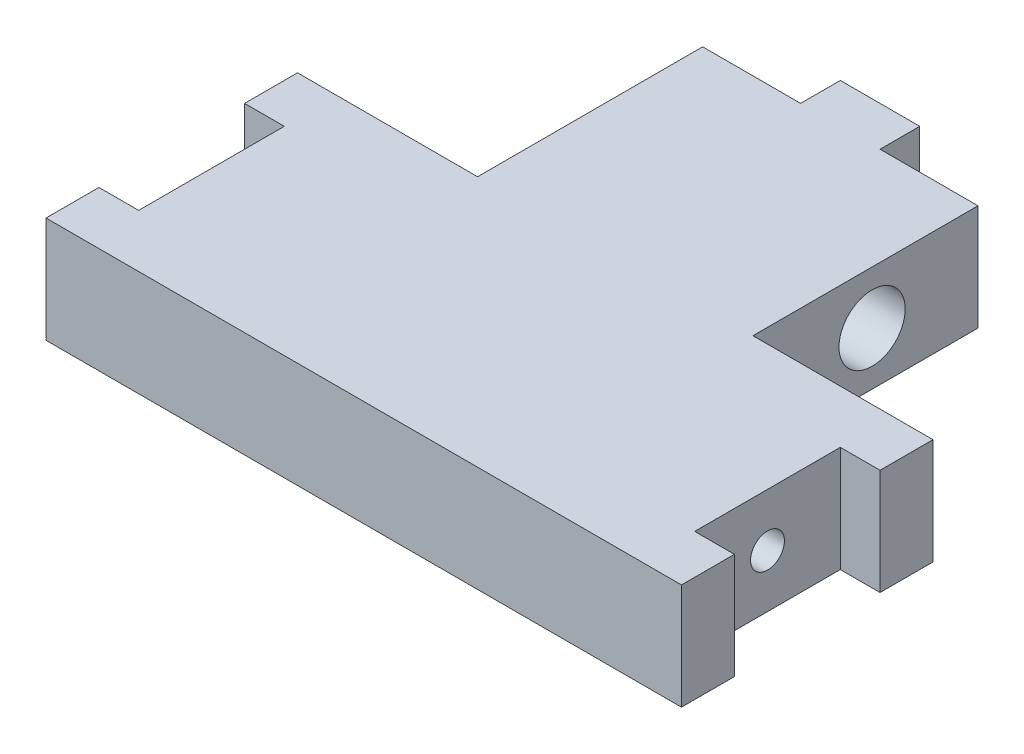
ISO-10303-21;
HEADER;
FILE_DESCRIPTION(('STEP AP214'),'2;1');
FILE_NAME('part.step','',(''),(''),'','','');
FILE_SCHEMA(('AUTOMOTIVE_DESIGN { 1 0 10303 214 1 1 1 1 }'));
ENDSEC;
DATA;
#1=APPLICATION_CONTEXT('core data for automotive mechanical design processes');
#2=APPLICATION_PROTOCOL_DEFINITION('international standard','automotive_design',2000,#1);
#3=PRODUCT_CONTEXT('',#1,'mechanical');
#4=PRODUCT('Part','Part','',(#3));
#5=PRODUCT_RELATED_PRODUCT_CATEGORY('part','',(#4));
#6=PRODUCT_DEFINITION_FORMATION('','',#4);
#7=PRODUCT_DEFINITION_CONTEXT('part definition',#1,'design');
#8=PRODUCT_DEFINITION('design','',#6,#7);
#9=PRODUCT_DEFINITION_SHAPE('','',#8);
#10=(LENGTH_UNIT() NAMED_UNIT(*) SI_UNIT(.MILLI.,.METRE.));
#11=(NAMED_UNIT(*) PLANE_ANGLE_UNIT() SI_UNIT($,.RADIAN.));
#12=(NAMED_UNIT(*) SI_UNIT($,.STERADIAN.) SOLID_ANGLE_UNIT());
#13=UNCERTAINTY_MEASURE_WITH_UNIT(LENGTH_MEASURE(1.E-05),#10,'distance_accuracy_value','');
#14=(GEOMETRIC_REPRESENTATION_CONTEXT(3) GLOBAL_UNCERTAINTY_ASSIGNED_CONTEXT((#13)) GLOBAL_UNIT_ASSIGNED_CONTEXT((#10,
#11,#12)) REPRESENTATION_CONTEXT('',''));
#15=CARTESIAN_POINT('',(0.,0.,0.));
#16=DIRECTION('',(0.,0.,1.));
#17=DIRECTION('',(1.,0.,0.));
#18=AXIS2_PLACEMENT_3D('',#15,#16,#17);
#19=CARTESIAN_POINT('',(-16.51,12.7,0.));
#20=DIRECTION('',(0.,0.,1.));
#21=DIRECTION('',(1.,0.,0.));
#22=AXIS2_PLACEMENT_3D('',#19,#20,#21);
#23=PLANE('',#22);
#24=CARTESIAN_POINT('',(-10.16,6.35,0.));
#25=DIRECTION('',(0.,0.,-1.));
#26=DIRECTION('',(-1.,0.,0.));
#27=AXIS2_PLACEMENT_3D('',#24,#25,#26);
#28=CIRCLE('',#27,1.1303);
#29=CARTESIAN_POINT('',(-11.2903,6.35,0.));
#30=VERTEX_POINT('',#29);
#31=EDGE_CURVE('E368',#30,#30,#28,.T.);
#32=ORIENTED_EDGE('',*,*,#31,.F.);
#33=EDGE_LOOP('',(#32));
#34=FACE_BOUND('',#33,.T.);
#35=DIRECTION('',(-1.,0.,0.));
#36=VECTOR('',#35,1.);
#37=CARTESIAN_POINT('',(-16.51,0.,0.));
#38=LINE('',#37,#36);
#39=CARTESIAN_POINT('',(-4.7625,0.,0.));
#40=VERTEX_POINT('',#39);
#41=CARTESIAN_POINT('',(-16.51,0.,0.));
#42=VERTEX_POINT('',#41);
#43=EDGE_CURVE('E202',#40,#42,#38,.T.);
#44=ORIENTED_EDGE('',*,*,#43,.T.);
#45=DIRECTION('',(0.,-1.,0.));
#46=VECTOR('',#45,1.);
#47=CARTESIAN_POINT('',(-16.51,12.7,0.));
#48=LINE('',#47,#46);
#49=CARTESIAN_POINT('',(-16.51,12.7,0.));
#50=VERTEX_POINT('',#49);
#51=EDGE_CURVE('E11',#50,#42,#48,.T.);
#52=ORIENTED_EDGE('',*,*,#51,.F.);
#53=DIRECTION('',(-1.,0.,0.));
#54=VECTOR('',#53,1.);
#55=CARTESIAN_POINT('',(-16.51,12.7,0.));
#56=LINE('',#55,#54);
#57=CARTESIAN_POINT('',(-4.7625,12.7,0.));
#58=VERTEX_POINT('',#57);
#59=EDGE_CURVE('E241',#58,#50,#56,.T.);
#60=ORIENTED_EDGE('',*,*,#59,.F.);
#61=DIRECTION('',(0.,-1.,0.));
#62=VECTOR('',#61,1.);
#63=CARTESIAN_POINT('',(-4.7625,12.7,0.));
#64=LINE('',#63,#62);
#65=EDGE_CURVE('E198',#58,#40,#64,.T.);
#66=ORIENTED_EDGE('',*,*,#65,.T.);
#67=EDGE_LOOP('',(#44,#52,#60,#66));
#68=FACE_BOUND('',#67,.T.);
#69=ADVANCED_FACE('F33',(#34,#68),#23,.F.);
#70=CARTESIAN_POINT('',(-16.51,12.7,0.));
#71=DIRECTION('',(1.,0.,0.));
#72=DIRECTION('',(0.,0.,-1.));
#73=AXIS2_PLACEMENT_3D('',#70,#71,#72);
#74=PLANE('',#73);
#75=CARTESIAN_POINT('',(-16.51,6.35,12.7));
#76=DIRECTION('',(1.,0.,0.));
#77=DIRECTION('',(0.,0.,-1.));
#78=AXIS2_PLACEMENT_3D('',#75,#76,#77);
#79=CIRCLE('',#78,3.96875);
#80=CARTESIAN_POINT('',(-16.51,6.35,8.73124999999999));
#81=VERTEX_POINT('',#80);
#82=EDGE_CURVE('E381',#81,#81,#79,.T.);
#83=ORIENTED_EDGE('',*,*,#82,.T.);
#84=EDGE_LOOP('',(#83));
#85=FACE_BOUND('',#84,.T.);
#86=DIRECTION('',(0.,0.,1.));
#87=VECTOR('',#86,1.);
#88=CARTESIAN_POINT('',(-16.51,0.,0.));
#89=LINE('',#88,#87);
#90=CARTESIAN_POINT('',(-16.51,0.,26.9875));
#91=VERTEX_POINT('',#90);
#92=EDGE_CURVE('E205',#42,#91,#89,.T.);
#93=ORIENTED_EDGE('',*,*,#92,.T.);
#94=DIRECTION('',(0.,-1.,0.));
#95=VECTOR('',#94,1.);
#96=CARTESIAN_POINT('',(-16.51,12.7,26.9875));
#97=LINE('',#96,#95);
#98=CARTESIAN_POINT('',(-16.51,12.7,26.9875));
#99=VERTEX_POINT('',#98);
#100=EDGE_CURVE('E42',#99,#91,#97,.T.);
#101=ORIENTED_EDGE('',*,*,#100,.F.);
#102=DIRECTION('',(0.,0.,1.));
#103=VECTOR('',#102,1.);
#104=CARTESIAN_POINT('',(-16.51,12.7,0.));
#105=LINE('',#104,#103);
#106=EDGE_CURVE('E129',#50,#99,#105,.T.);
#107=ORIENTED_EDGE('',*,*,#106,.F.);
#108=ORIENTED_EDGE('',*,*,#51,.T.);
#109=EDGE_LOOP('',(#93,#101,#107,#108));
#110=FACE_BOUND('',#109,.T.);
#111=ADVANCED_FACE('F360',(#85,#110),#74,.F.);
#112=CARTESIAN_POINT('',(-16.51,12.7,26.9875));
#113=DIRECTION('',(0.,0.,1.));
#114=DIRECTION('',(1.,0.,0.));
#115=AXIS2_PLACEMENT_3D('',#112,#113,#114);
#116=PLANE('',#115);
#117=DIRECTION('',(-1.,0.,0.));
#118=VECTOR('',#117,1.);
#119=CARTESIAN_POINT('',(-16.51,0.,26.9875));
#120=LINE('',#119,#118);
#121=CARTESIAN_POINT('',(-38.1,0.,26.9875));
#122=VERTEX_POINT('',#121);
#123=EDGE_CURVE('E208',#91,#122,#120,.T.);
#124=ORIENTED_EDGE('',*,*,#123,.T.);
#125=DIRECTION('',(0.,-1.,0.));
#126=VECTOR('',#125,1.);
#127=CARTESIAN_POINT('',(-38.1,12.7,26.9875));
#128=LINE('',#127,#126);
#129=CARTESIAN_POINT('',(-38.1,12.7,26.9875));
#130=VERTEX_POINT('',#129);
#131=EDGE_CURVE('E284',#130,#122,#128,.T.);
#132=ORIENTED_EDGE('',*,*,#131,.F.);
#133=DIRECTION('',(-1.,0.,0.));
#134=VECTOR('',#133,1.);
#135=CARTESIAN_POINT('',(-16.51,12.7,26.9875));
#136=LINE('',#135,#134);
#137=EDGE_CURVE('E293',#99,#130,#136,.T.);
#138=ORIENTED_EDGE('',*,*,#137,.F.);
#139=ORIENTED_EDGE('',*,*,#100,.T.);
#140=EDGE_LOOP('',(#124,#132,#138,#139));
#141=FACE_BOUND('',#140,.T.);
#142=ADVANCED_FACE('F291',(#141),#116,.F.);
#143=CARTESIAN_POINT('',(-38.1,12.7,26.9875));
#144=DIRECTION('',(1.,0.,0.));
#145=DIRECTION('',(0.,0.,-1.));
#146=AXIS2_PLACEMENT_3D('',#143,#144,#145);
#147=PLANE('',#146);
#148=DIRECTION('',(0.,0.,1.));
#149=VECTOR('',#148,1.);
#150=CARTESIAN_POINT('',(-38.1,0.,26.9875));
#151=LINE('',#150,#149);
#152=CARTESIAN_POINT('',(-38.1,0.,33.3375));
#153=VERTEX_POINT('',#152);
#154=EDGE_CURVE('E210',#122,#153,#151,.T.);
#155=ORIENTED_EDGE('',*,*,#154,.T.);
#156=DIRECTION('',(0.,-1.,0.));
#157=VECTOR('',#156,1.);
#158=CARTESIAN_POINT('',(-38.1,12.7,33.3375));
#159=LINE('',#158,#157);
#160=CARTESIAN_POINT('',(-38.1,12.7,33.3375));
#161=VERTEX_POINT('',#160);
#162=EDGE_CURVE('E281',#161,#153,#159,.T.);
#163=ORIENTED_EDGE('',*,*,#162,.F.);
#164=DIRECTION('',(0.,0.,1.));
#165=VECTOR('',#164,1.);
#166=CARTESIAN_POINT('',(-38.1,12.7,26.9875));
#167=LINE('',#166,#165);
#168=EDGE_CURVE('E311',#130,#161,#167,.T.);
#169=ORIENTED_EDGE('',*,*,#168,.F.);
#170=ORIENTED_EDGE('',*,*,#131,.T.);
#171=EDGE_LOOP('',(#155,#163,#169,#170));
#172=FACE_BOUND('',#171,.T.);
#173=ADVANCED_FACE('F302',(#172),#147,.F.);
#174=CARTESIAN_POINT('',(-38.1,12.7,33.3375));
#175=DIRECTION('',(0.,0.,-1.));
#176=DIRECTION('',(-1.,0.,0.));
#177=AXIS2_PLACEMENT_3D('',#174,#175,#176);
#178=PLANE('',#177);
#179=DIRECTION('',(1.,0.,0.));
#180=VECTOR('',#179,1.);
#181=CARTESIAN_POINT('',(-38.1,0.,33.3375));
#182=LINE('',#181,#180);
#183=CARTESIAN_POINT('',(-33.3375,0.,33.3375));
#184=VERTEX_POINT('',#183);
#185=EDGE_CURVE('E212',#153,#184,#182,.T.);
#186=ORIENTED_EDGE('',*,*,#185,.T.);
#187=DIRECTION('',(0.,-1.,0.));
#188=VECTOR('',#187,1.);
#189=CARTESIAN_POINT('',(-33.3375,12.7,33.3375));
#190=LINE('',#189,#188);
#191=CARTESIAN_POINT('',(-33.3375,12.7,33.3375));
#192=VERTEX_POINT('',#191);
#193=EDGE_CURVE('E278',#192,#184,#190,.T.);
#194=ORIENTED_EDGE('',*,*,#193,.F.);
#195=DIRECTION('',(1.,0.,0.));
#196=VECTOR('',#195,1.);
#197=CARTESIAN_POINT('',(-38.1,12.7,33.3375));
#198=LINE('',#197,#196);
#199=EDGE_CURVE('E308',#161,#192,#198,.T.);
#200=ORIENTED_EDGE('',*,*,#199,.F.);
#201=ORIENTED_EDGE('',*,*,#162,.T.);
#202=EDGE_LOOP('',(#186,#194,#200,#201));
#203=FACE_BOUND('',#202,.T.);
#204=ADVANCED_FACE('F306',(#203),#178,.F.);
#205=CARTESIAN_POINT('',(-33.3375,12.7,33.3375));
#206=DIRECTION('',(1.,0.,0.));
#207=DIRECTION('',(0.,0.,-1.));
#208=AXIS2_PLACEMENT_3D('',#205,#206,#207);
#209=PLANE('',#208);
#210=CARTESIAN_POINT('',(-33.3375,6.35,42.06875));
#211=DIRECTION('',(1.,0.,0.));
#212=DIRECTION('',(0.,0.,-1.));
#213=AXIS2_PLACEMENT_3D('',#210,#211,#212);
#214=CIRCLE('',#213,2.032);
#215=CARTESIAN_POINT('',(-33.3375,6.35,40.03675));
#216=VERTEX_POINT('',#215);
#217=EDGE_CURVE('E206',#216,#216,#214,.T.);
#218=ORIENTED_EDGE('',*,*,#217,.T.);
#219=EDGE_LOOP('',(#218));
#220=FACE_BOUND('',#219,.T.);
#221=DIRECTION('',(0.,0.,1.));
#222=VECTOR('',#221,1.);
#223=CARTESIAN_POINT('',(-33.3375,0.,33.3375));
#224=LINE('',#223,#222);
#225=CARTESIAN_POINT('',(-33.3375,0.,50.8));
#226=VERTEX_POINT('',#225);
#227=EDGE_CURVE('E214',#184,#226,#224,.T.);
#228=ORIENTED_EDGE('',*,*,#227,.T.);
#229=DIRECTION('',(0.,-1.,0.));
#230=VECTOR('',#229,1.);
#231=CARTESIAN_POINT('',(-33.3375,12.7,50.8));
#232=LINE('',#231,#230);
#233=CARTESIAN_POINT('',(-33.3375,12.7,50.8));
#234=VERTEX_POINT('',#233);
#235=EDGE_CURVE('E275',#234,#226,#232,.T.);
#236=ORIENTED_EDGE('',*,*,#235,.F.);
#237=DIRECTION('',(0.,0.,1.));
#238=VECTOR('',#237,1.);
#239=CARTESIAN_POINT('',(-33.3375,12.7,33.3375));
#240=LINE('',#239,#238);
#241=EDGE_CURVE('E310',#192,#234,#240,.T.);
#242=ORIENTED_EDGE('',*,*,#241,.F.);
#243=ORIENTED_EDGE('',*,*,#193,.T.);
#244=EDGE_LOOP('',(#228,#236,#242,#243));
#245=FACE_BOUND('',#244,.T.);
#246=ADVANCED_FACE('F392',(#220,#245),#209,.F.);
#247=CARTESIAN_POINT('',(-33.3375,12.7,50.8));
#248=DIRECTION('',(0.,0.,1.));
#249=DIRECTION('',(1.,0.,0.));
#250=AXIS2_PLACEMENT_3D('',#247,#248,#249);
#251=PLANE('',#250);
#252=DIRECTION('',(-1.,0.,0.));
#253=VECTOR('',#252,1.);
#254=CARTESIAN_POINT('',(-33.3375,0.,50.8));
#255=LINE('',#254,#253);
#256=CARTESIAN_POINT('',(-38.1,0.,50.8));
#257=VERTEX_POINT('',#256);
#258=EDGE_CURVE('E216',#226,#257,#255,.T.);
#259=ORIENTED_EDGE('',*,*,#258,.T.);
#260=DIRECTION('',(0.,-1.,0.));
#261=VECTOR('',#260,1.);
#262=CARTESIAN_POINT('',(-38.1,12.7,50.8));
#263=LINE('',#262,#261);
#264=CARTESIAN_POINT('',(-38.1,12.7,50.8));
#265=VERTEX_POINT('',#264);
#266=EDGE_CURVE('E272',#265,#257,#263,.T.);
#267=ORIENTED_EDGE('',*,*,#266,.F.);
#268=DIRECTION('',(-1.,0.,0.));
#269=VECTOR('',#268,1.);
#270=CARTESIAN_POINT('',(-33.3375,12.7,50.8));
#271=LINE('',#270,#269);
#272=EDGE_CURVE('E313',#234,#265,#271,.T.);
#273=ORIENTED_EDGE('',*,*,#272,.F.);
#274=ORIENTED_EDGE('',*,*,#235,.T.);
#275=EDGE_LOOP('',(#259,#267,#273,#274));
#276=FACE_BOUND('',#275,.T.);
#277=ADVANCED_FACE('F507',(#276),#251,.F.);
#278=CARTESIAN_POINT('',(-38.1,12.7,50.8));
#279=DIRECTION('',(1.,0.,0.));
#280=DIRECTION('',(0.,0.,-1.));
#281=AXIS2_PLACEMENT_3D('',#278,#279,#280);
#282=PLANE('',#281);
#283=DIRECTION('',(0.,0.,1.));
#284=VECTOR('',#283,1.);
#285=CARTESIAN_POINT('',(-38.1,0.,50.8));
#286=LINE('',#285,#284);
#287=CARTESIAN_POINT('',(-38.1,0.,57.15));
#288=VERTEX_POINT('',#287);
#289=EDGE_CURVE('E218',#257,#288,#286,.T.);
#290=ORIENTED_EDGE('',*,*,#289,.T.);
#291=DIRECTION('',(0.,-1.,0.));
#292=VECTOR('',#291,1.);
#293=CARTESIAN_POINT('',(-38.1,12.7,57.15));
#294=LINE('',#293,#292);
#295=CARTESIAN_POINT('',(-38.1,12.7,57.15));
#296=VERTEX_POINT('',#295);
#297=EDGE_CURVE('E269',#296,#288,#294,.T.);
#298=ORIENTED_EDGE('',*,*,#297,.F.);
#299=DIRECTION('',(0.,0.,1.));
#300=VECTOR('',#299,1.);
#301=CARTESIAN_POINT('',(-38.1,12.7,50.8));
#302=LINE('',#301,#300);
#303=EDGE_CURVE('E319',#265,#296,#302,.T.);
#304=ORIENTED_EDGE('',*,*,#303,.F.);
#305=ORIENTED_EDGE('',*,*,#266,.T.);
#306=EDGE_LOOP('',(#290,#298,#304,#305));
#307=FACE_BOUND('',#306,.T.);
#308=ADVANCED_FACE('F582',(#307),#282,.F.);
#309=CARTESIAN_POINT('',(-38.1,12.7,57.15));
#310=DIRECTION('',(0.,0.,-1.));
#311=DIRECTION('',(-1.,0.,0.));
#312=AXIS2_PLACEMENT_3D('',#309,#310,#311);
#313=PLANE('',#312);
#314=DIRECTION('',(1.,0.,0.));
#315=VECTOR('',#314,1.);
#316=CARTESIAN_POINT('',(-38.1,0.,57.15));
#317=LINE('',#316,#315);
#318=CARTESIAN_POINT('',(38.1,0.,57.15));
#319=VERTEX_POINT('',#318);
#320=EDGE_CURVE('E220',#288,#319,#317,.T.);
#321=ORIENTED_EDGE('',*,*,#320,.T.);
#322=DIRECTION('',(0.,-1.,0.));
#323=VECTOR('',#322,1.);
#324=CARTESIAN_POINT('',(38.1,12.7,57.15));
#325=LINE('',#324,#323);
#326=CARTESIAN_POINT('',(38.1,12.7,57.15));
#327=VERTEX_POINT('',#326);
#328=EDGE_CURVE('E266',#327,#319,#325,.T.);
#329=ORIENTED_EDGE('',*,*,#328,.F.);
#330=DIRECTION('',(1.,0.,0.));
#331=VECTOR('',#330,1.);
#332=CARTESIAN_POINT('',(-38.1,12.7,57.15));
#333=LINE('',#332,#331);
#334=EDGE_CURVE('E321',#296,#327,#333,.T.);
#335=ORIENTED_EDGE('',*,*,#334,.F.);
#336=ORIENTED_EDGE('',*,*,#297,.T.);
#337=EDGE_LOOP('',(#321,#329,#335,#336));
#338=FACE_BOUND('',#337,.T.);
#339=ADVANCED_FACE('F572',(#338),#313,.F.);
#340=CARTESIAN_POINT('',(38.1,12.7,50.8));
#341=DIRECTION('',(-1.,0.,0.));
#342=DIRECTION('',(0.,0.,1.));
#343=AXIS2_PLACEMENT_3D('',#340,#341,#342);
#344=PLANE('',#343);
#345=DIRECTION('',(0.,0.,-1.));
#346=VECTOR('',#345,1.);
#347=CARTESIAN_POINT('',(38.1,0.,50.8));
#348=LINE('',#347,#346);
#349=CARTESIAN_POINT('',(38.1,0.,50.8));
#350=VERTEX_POINT('',#349);
#351=EDGE_CURVE('E222',#319,#350,#348,.T.);
#352=ORIENTED_EDGE('',*,*,#351,.T.);
#353=DIRECTION('',(0.,-1.,0.));
#354=VECTOR('',#353,1.);
#355=CARTESIAN_POINT('',(38.1,12.7,50.8));
#356=LINE('',#355,#354);
#357=CARTESIAN_POINT('',(38.1,12.7,50.8));
#358=VERTEX_POINT('',#357);
#359=EDGE_CURVE('E263',#358,#350,#356,.T.);
#360=ORIENTED_EDGE('',*,*,#359,.F.);
#361=DIRECTION('',(0.,0.,-1.));
#362=VECTOR('',#361,1.);
#363=CARTESIAN_POINT('',(38.1,12.7,50.8));
#364=LINE('',#363,#362);
#365=EDGE_CURVE('E323',#327,#358,#364,.T.);
#366=ORIENTED_EDGE('',*,*,#365,.F.);
#367=ORIENTED_EDGE('',*,*,#328,.T.);
#368=EDGE_LOOP('',(#352,#360,#366,#367));
#369=FACE_BOUND('',#368,.T.);
#370=ADVANCED_FACE('F562',(#369),#344,.F.);
#371=CARTESIAN_POINT('',(33.3375,12.7,50.8));
#372=DIRECTION('',(0.,0.,1.));
#373=DIRECTION('',(1.,0.,0.));
#374=AXIS2_PLACEMENT_3D('',#371,#372,#373);
#375=PLANE('',#374);
#376=DIRECTION('',(-1.,0.,0.));
#377=VECTOR('',#376,1.);
#378=CARTESIAN_POINT('',(33.3375,0.,50.8));
#379=LINE('',#378,#377);
#380=CARTESIAN_POINT('',(33.3375,0.,50.8));
#381=VERTEX_POINT('',#380);
#382=EDGE_CURVE('E224',#350,#381,#379,.T.);
#383=ORIENTED_EDGE('',*,*,#382,.T.);
#384=DIRECTION('',(0.,-1.,0.));
#385=VECTOR('',#384,1.);
#386=CARTESIAN_POINT('',(33.3375,12.7,50.8));
#387=LINE('',#386,#385);
#388=CARTESIAN_POINT('',(33.3375,12.7,50.8));
#389=VERTEX_POINT('',#388);
#390=EDGE_CURVE('E260',#389,#381,#387,.T.);
#391=ORIENTED_EDGE('',*,*,#390,.F.);
#392=DIRECTION('',(-1.,0.,0.));
#393=VECTOR('',#392,1.);
#394=CARTESIAN_POINT('',(33.3375,12.7,50.8));
#395=LINE('',#394,#393);
#396=EDGE_CURVE('E325',#358,#389,#395,.T.);
#397=ORIENTED_EDGE('',*,*,#396,.F.);
#398=ORIENTED_EDGE('',*,*,#359,.T.);
#399=EDGE_LOOP('',(#383,#391,#397,#398));
#400=FACE_BOUND('',#399,.T.);
#401=ADVANCED_FACE('F521',(#400),#375,.F.);
#402=CARTESIAN_POINT('',(33.3375,12.7,33.3375));
#403=DIRECTION('',(-1.,0.,0.));
#404=DIRECTION('',(0.,0.,1.));
#405=AXIS2_PLACEMENT_3D('',#402,#403,#404);
#406=PLANE('',#405);
#407=CARTESIAN_POINT('',(33.3375,6.35,42.06875));
#408=DIRECTION('',(1.,0.,0.));
#409=DIRECTION('',(0.,0.,-1.));
#410=AXIS2_PLACEMENT_3D('',#407,#408,#409);
#411=CIRCLE('',#410,2.032);
#412=CARTESIAN_POINT('',(33.3375,6.35,40.03675));
#413=VERTEX_POINT('',#412);
#414=EDGE_CURVE('E384',#413,#413,#411,.T.);
#415=ORIENTED_EDGE('',*,*,#414,.F.);
#416=EDGE_LOOP('',(#415));
#417=FACE_BOUND('',#416,.T.);
#418=DIRECTION('',(0.,0.,-1.));
#419=VECTOR('',#418,1.);
#420=CARTESIAN_POINT('',(33.3375,0.,33.3375));
#421=LINE('',#420,#419);
#422=CARTESIAN_POINT('',(33.3375,0.,33.3375));
#423=VERTEX_POINT('',#422);
#424=EDGE_CURVE('E226',#381,#423,#421,.T.);
#425=ORIENTED_EDGE('',*,*,#424,.T.);
#426=DIRECTION('',(0.,-1.,0.));
#427=VECTOR('',#426,1.);
#428=CARTESIAN_POINT('',(33.3375,12.7,33.3375));
#429=LINE('',#428,#427);
#430=CARTESIAN_POINT('',(33.3375,12.7,33.3375));
#431=VERTEX_POINT('',#430);
#432=EDGE_CURVE('E257',#431,#423,#429,.T.);
#433=ORIENTED_EDGE('',*,*,#432,.F.);
#434=DIRECTION('',(0.,0.,-1.));
#435=VECTOR('',#434,1.);
#436=CARTESIAN_POINT('',(33.3375,12.7,33.3375));
#437=LINE('',#436,#435);
#438=EDGE_CURVE('E327',#389,#431,#437,.T.);
#439=ORIENTED_EDGE('',*,*,#438,.F.);
#440=ORIENTED_EDGE('',*,*,#390,.T.);
#441=EDGE_LOOP('',(#425,#433,#439,#440));
#442=FACE_BOUND('',#441,.T.);
#443=ADVANCED_FACE('F516',(#417,#442),#406,.F.);
#444=CARTESIAN_POINT('',(38.1,12.7,33.3375));
#445=DIRECTION('',(0.,0.,-1.));
#446=DIRECTION('',(-1.,0.,0.));
#447=AXIS2_PLACEMENT_3D('',#444,#445,#446);
#448=PLANE('',#447);
#449=DIRECTION('',(1.,0.,0.));
#450=VECTOR('',#449,1.);
#451=CARTESIAN_POINT('',(38.1,0.,33.3375));
#452=LINE('',#451,#450);
#453=CARTESIAN_POINT('',(38.1,0.,33.3375));
#454=VERTEX_POINT('',#453);
#455=EDGE_CURVE('E228',#423,#454,#452,.T.);
#456=ORIENTED_EDGE('',*,*,#455,.T.);
#457=DIRECTION('',(0.,-1.,0.));
#458=VECTOR('',#457,1.);
#459=CARTESIAN_POINT('',(38.1,12.7,33.3375));
#460=LINE('',#459,#458);
#461=CARTESIAN_POINT('',(38.1,12.7,33.3375));
#462=VERTEX_POINT('',#461);
#463=EDGE_CURVE('E254',#462,#454,#460,.T.);
#464=ORIENTED_EDGE('',*,*,#463,.F.);
#465=DIRECTION('',(1.,0.,0.));
#466=VECTOR('',#465,1.);
#467=CARTESIAN_POINT('',(38.1,12.7,33.3375));
#468=LINE('',#467,#466);
#469=EDGE_CURVE('E329',#431,#462,#468,.T.);
#470=ORIENTED_EDGE('',*,*,#469,.F.);
#471=ORIENTED_EDGE('',*,*,#432,.T.);
#472=EDGE_LOOP('',(#456,#464,#470,#471));
#473=FACE_BOUND('',#472,.T.);
#474=ADVANCED_FACE('F520',(#473),#448,.F.);
#475=CARTESIAN_POINT('',(38.1,12.7,26.9875));
#476=DIRECTION('',(-1.,0.,0.));
#477=DIRECTION('',(0.,0.,1.));
#478=AXIS2_PLACEMENT_3D('',#475,#476,#477);
#479=PLANE('',#478);
#480=DIRECTION('',(0.,0.,-1.));
#481=VECTOR('',#480,1.);
#482=CARTESIAN_POINT('',(38.1,0.,26.9875));
#483=LINE('',#482,#481);
#484=CARTESIAN_POINT('',(38.1,0.,26.9875));
#485=VERTEX_POINT('',#484);
#486=EDGE_CURVE('E230',#454,#485,#483,.T.);
#487=ORIENTED_EDGE('',*,*,#486,.T.);
#488=DIRECTION('',(0.,-1.,0.));
#489=VECTOR('',#488,1.);
#490=CARTESIAN_POINT('',(38.1,12.7,26.9875));
#491=LINE('',#490,#489);
#492=CARTESIAN_POINT('',(38.1,12.7,26.9875));
#493=VERTEX_POINT('',#492);
#494=EDGE_CURVE('E251',#493,#485,#491,.T.);
#495=ORIENTED_EDGE('',*,*,#494,.F.);
#496=DIRECTION('',(0.,0.,-1.));
#497=VECTOR('',#496,1.);
#498=CARTESIAN_POINT('',(38.1,12.7,26.9875));
#499=LINE('',#498,#497);
#500=EDGE_CURVE('E331',#462,#493,#499,.T.);
#501=ORIENTED_EDGE('',*,*,#500,.F.);
#502=ORIENTED_EDGE('',*,*,#463,.T.);
#503=EDGE_LOOP('',(#487,#495,#501,#502));
#504=FACE_BOUND('',#503,.T.);
#505=ADVANCED_FACE('F541',(#504),#479,.F.);
#506=CARTESIAN_POINT('',(16.51,12.7,26.9875));
#507=DIRECTION('',(0.,0.,1.));
#508=DIRECTION('',(1.,0.,0.));
#509=AXIS2_PLACEMENT_3D('',#506,#507,#508);
#510=PLANE('',#509);
#511=DIRECTION('',(-1.,0.,0.));
#512=VECTOR('',#511,1.);
#513=CARTESIAN_POINT('',(16.51,0.,26.9875));
#514=LINE('',#513,#512);
#515=CARTESIAN_POINT('',(16.51,0.,26.9875));
#516=VERTEX_POINT('',#515);
#517=EDGE_CURVE('E232',#485,#516,#514,.T.);
#518=ORIENTED_EDGE('',*,*,#517,.T.);
#519=DIRECTION('',(0.,-1.,0.));
#520=VECTOR('',#519,1.);
#521=CARTESIAN_POINT('',(16.51,12.7,26.9875));
#522=LINE('',#521,#520);
#523=CARTESIAN_POINT('',(16.51,12.7,26.9875));
#524=VERTEX_POINT('',#523);
#525=EDGE_CURVE('E248',#524,#516,#522,.T.);
#526=ORIENTED_EDGE('',*,*,#525,.F.);
#527=DIRECTION('',(-1.,0.,0.));
#528=VECTOR('',#527,1.);
#529=CARTESIAN_POINT('',(16.51,12.7,26.9875));
#530=LINE('',#529,#528);
#531=EDGE_CURVE('E333',#493,#524,#530,.T.);
#532=ORIENTED_EDGE('',*,*,#531,.F.);
#533=ORIENTED_EDGE('',*,*,#494,.T.);
#534=EDGE_LOOP('',(#518,#526,#532,#533));
#535=FACE_BOUND('',#534,.T.);
#536=ADVANCED_FACE('F532',(#535),#510,.F.);
#537=CARTESIAN_POINT('',(16.51,12.7,0.));
#538=DIRECTION('',(-1.,0.,0.));
#539=DIRECTION('',(0.,0.,1.));
#540=AXIS2_PLACEMENT_3D('',#537,#538,#539);
#541=PLANE('',#540);
#542=CARTESIAN_POINT('',(16.51,6.35,12.7));
#543=DIRECTION('',(-1.,0.,0.));
#544=DIRECTION('',(0.,0.,1.));
#545=AXIS2_PLACEMENT_3D('',#542,#543,#544);
#546=CIRCLE('',#545,3.96875);
#547=CARTESIAN_POINT('',(16.51,6.35,16.66875));
#548=VERTEX_POINT('',#547);
#549=EDGE_CURVE('E36',#548,#548,#546,.T.);
#550=ORIENTED_EDGE('',*,*,#549,.T.);
#551=EDGE_LOOP('',(#550));
#552=FACE_BOUND('',#551,.T.);
#553=DIRECTION('',(0.,0.,-1.));
#554=VECTOR('',#553,1.);
#555=CARTESIAN_POINT('',(16.51,0.,0.));
#556=LINE('',#555,#554);
#557=CARTESIAN_POINT('',(16.51,0.,0.));
#558=VERTEX_POINT('',#557);
#559=EDGE_CURVE('E234',#516,#558,#556,.T.);
#560=ORIENTED_EDGE('',*,*,#559,.T.);
#561=DIRECTION('',(0.,-1.,0.));
#562=VECTOR('',#561,1.);
#563=CARTESIAN_POINT('',(16.51,12.7,0.));
#564=LINE('',#563,#562);
#565=CARTESIAN_POINT('',(16.51,12.7,0.));
#566=VERTEX_POINT('',#565);
#567=EDGE_CURVE('E245',#566,#558,#564,.T.);
#568=ORIENTED_EDGE('',*,*,#567,.F.);
#569=DIRECTION('',(0.,0.,-1.));
#570=VECTOR('',#569,1.);
#571=CARTESIAN_POINT('',(16.51,12.7,0.));
#572=LINE('',#571,#570);
#573=EDGE_CURVE('E335',#524,#566,#572,.T.);
#574=ORIENTED_EDGE('',*,*,#573,.F.);
#575=ORIENTED_EDGE('',*,*,#525,.T.);
#576=EDGE_LOOP('',(#560,#568,#574,#575));
#577=FACE_BOUND('',#576,.T.);
#578=ADVANCED_FACE('F341',(#552,#577),#541,.F.);
#579=CARTESIAN_POINT('',(16.51,12.7,0.));
#580=DIRECTION('',(0.,0.,1.));
#581=DIRECTION('',(1.,0.,0.));
#582=AXIS2_PLACEMENT_3D('',#579,#580,#581);
#583=PLANE('',#582);
#584=CARTESIAN_POINT('',(10.16,6.35,0.));
#585=DIRECTION('',(0.,0.,-1.));
#586=DIRECTION('',(-1.,0.,0.));
#587=AXIS2_PLACEMENT_3D('',#584,#585,#586);
#588=CIRCLE('',#587,1.1303);
#589=CARTESIAN_POINT('',(9.0297,6.35,0.));
#590=VERTEX_POINT('',#589);
#591=EDGE_CURVE('E373',#590,#590,#588,.T.);
#592=ORIENTED_EDGE('',*,*,#591,.F.);
#593=EDGE_LOOP('',(#592));
#594=FACE_BOUND('',#593,.T.);
#595=DIRECTION('',(-1.,0.,0.));
#596=VECTOR('',#595,1.);
#597=CARTESIAN_POINT('',(16.51,0.,0.));
#598=LINE('',#597,#596);
#599=CARTESIAN_POINT('',(4.7625,0.,0.));
#600=VERTEX_POINT('',#599);
#601=EDGE_CURVE('E236',#558,#600,#598,.T.);
#602=ORIENTED_EDGE('',*,*,#601,.T.);
#603=DIRECTION('',(0.,-1.,0.));
#604=VECTOR('',#603,1.);
#605=CARTESIAN_POINT('',(4.7625,12.7,0.));
#606=LINE('',#605,#604);
#607=CARTESIAN_POINT('',(4.7625,12.7,0.));
#608=VERTEX_POINT('',#607);
#609=EDGE_CURVE('E193',#608,#600,#606,.T.);
#610=ORIENTED_EDGE('',*,*,#609,.F.);
#611=DIRECTION('',(-1.,0.,0.));
#612=VECTOR('',#611,1.);
#613=CARTESIAN_POINT('',(16.51,12.7,0.));
#614=LINE('',#613,#612);
#615=EDGE_CURVE('E184',#566,#608,#614,.T.);
#616=ORIENTED_EDGE('',*,*,#615,.F.);
#617=ORIENTED_EDGE('',*,*,#567,.T.);
#618=EDGE_LOOP('',(#602,#610,#616,#617));
#619=FACE_BOUND('',#618,.T.);
#620=ADVANCED_FACE('F345',(#594,#619),#583,.F.);
#621=CARTESIAN_POINT('',(4.7625,12.7,0.));
#622=DIRECTION('',(-1.,0.,0.));
#623=DIRECTION('',(0.,0.,1.));
#624=AXIS2_PLACEMENT_3D('',#621,#622,#623);
#625=PLANE('',#624);
#626=DIRECTION('',(0.,0.,-1.));
#627=VECTOR('',#626,1.);
#628=CARTESIAN_POINT('',(4.7625,0.,0.));
#629=LINE('',#628,#627);
#630=CARTESIAN_POINT('',(4.7625,0.,-4.7625));
#631=VERTEX_POINT('',#630);
#632=EDGE_CURVE('E192',#600,#631,#629,.T.);
#633=ORIENTED_EDGE('',*,*,#632,.T.);
#634=DIRECTION('',(0.,-1.,0.));
#635=VECTOR('',#634,1.);
#636=CARTESIAN_POINT('',(4.7625,12.7,-4.7625));
#637=LINE('',#636,#635);
#638=CARTESIAN_POINT('',(4.7625,12.7,-4.7625));
#639=VERTEX_POINT('',#638);
#640=EDGE_CURVE('E189',#639,#631,#637,.T.);
#641=ORIENTED_EDGE('',*,*,#640,.F.);
#642=DIRECTION('',(0.,0.,-1.));
#643=VECTOR('',#642,1.);
#644=CARTESIAN_POINT('',(4.7625,12.7,0.));
#645=LINE('',#644,#643);
#646=EDGE_CURVE('E178',#608,#639,#645,.T.);
#647=ORIENTED_EDGE('',*,*,#646,.F.);
#648=ORIENTED_EDGE('',*,*,#609,.T.);
#649=EDGE_LOOP('',(#633,#641,#647,#648));
#650=FACE_BOUND('',#649,.T.);
#651=ADVANCED_FACE('F190',(#650),#625,.F.);
#652=CARTESIAN_POINT('',(4.7625,12.7,-4.7625));
#653=DIRECTION('',(0.,0.,1.));
#654=DIRECTION('',(1.,0.,0.));
#655=AXIS2_PLACEMENT_3D('',#652,#653,#654);
#656=PLANE('',#655);
#657=DIRECTION('',(-1.,0.,0.));
#658=VECTOR('',#657,1.);
#659=CARTESIAN_POINT('',(4.7625,0.,-4.7625));
#660=LINE('',#659,#658);
#661=CARTESIAN_POINT('',(-4.7625,0.,-4.7625));
#662=VERTEX_POINT('',#661);
#663=EDGE_CURVE('E115',#631,#662,#660,.T.);
#664=ORIENTED_EDGE('',*,*,#663,.T.);
#665=DIRECTION('',(0.,-1.,0.));
#666=VECTOR('',#665,1.);
#667=CARTESIAN_POINT('',(-4.7625,12.7,-4.7625));
#668=LINE('',#667,#666);
#669=CARTESIAN_POINT('',(-4.7625,12.7,-4.7625));
#670=VERTEX_POINT('',#669);
#671=EDGE_CURVE('E194',#670,#662,#668,.T.);
#672=ORIENTED_EDGE('',*,*,#671,.F.);
#673=DIRECTION('',(-1.,0.,0.));
#674=VECTOR('',#673,1.);
#675=CARTESIAN_POINT('',(4.7625,12.7,-4.7625));
#676=LINE('',#675,#674);
#677=EDGE_CURVE('E182',#639,#670,#676,.T.);
#678=ORIENTED_EDGE('',*,*,#677,.F.);
#679=ORIENTED_EDGE('',*,*,#640,.T.);
#680=EDGE_LOOP('',(#664,#672,#678,#679));
#681=FACE_BOUND('',#680,.T.);
#682=ADVANCED_FACE('F196',(#681),#656,.F.);
#683=CARTESIAN_POINT('',(-4.7625,12.7,0.));
#684=DIRECTION('',(1.,0.,0.));
#685=DIRECTION('',(0.,0.,-1.));
#686=AXIS2_PLACEMENT_3D('',#683,#684,#685);
#687=PLANE('',#686);
#688=DIRECTION('',(0.,0.,1.));
#689=VECTOR('',#688,1.);
#690=CARTESIAN_POINT('',(-4.7625,0.,0.));
#691=LINE('',#690,#689);
#692=EDGE_CURVE('E121',#662,#40,#691,.T.);
#693=ORIENTED_EDGE('',*,*,#692,.T.);
#694=ORIENTED_EDGE('',*,*,#65,.F.);
#695=DIRECTION('',(0.,0.,1.));
#696=VECTOR('',#695,1.);
#697=CARTESIAN_POINT('',(-4.7625,12.7,0.));
#698=LINE('',#697,#696);
#699=EDGE_CURVE('E50',#670,#58,#698,.T.);
#700=ORIENTED_EDGE('',*,*,#699,.F.);
#701=ORIENTED_EDGE('',*,*,#671,.T.);
#702=EDGE_LOOP('',(#693,#694,#700,#701));
#703=FACE_BOUND('',#702,.T.);
#704=ADVANCED_FACE('F349',(#703),#687,.F.);
#705=CARTESIAN_POINT('',(-4.7625,12.7,0.));
#706=DIRECTION('',(0.,1.,0.));
#707=DIRECTION('',(0.,0.,1.));
#708=AXIS2_PLACEMENT_3D('',#705,#706,#707);
#709=PLANE('',#708);
#710=ORIENTED_EDGE('',*,*,#59,.T.);
#711=ORIENTED_EDGE('',*,*,#106,.T.);
#712=ORIENTED_EDGE('',*,*,#137,.T.);
#713=ORIENTED_EDGE('',*,*,#168,.T.);
#714=ORIENTED_EDGE('',*,*,#199,.T.);
#715=ORIENTED_EDGE('',*,*,#241,.T.);
#716=ORIENTED_EDGE('',*,*,#272,.T.);
#717=ORIENTED_EDGE('',*,*,#303,.T.);
#718=ORIENTED_EDGE('',*,*,#334,.T.);
#719=ORIENTED_EDGE('',*,*,#365,.T.);
#720=ORIENTED_EDGE('',*,*,#396,.T.);
#721=ORIENTED_EDGE('',*,*,#438,.T.);
#722=ORIENTED_EDGE('',*,*,#469,.T.);
#723=ORIENTED_EDGE('',*,*,#500,.T.);
#724=ORIENTED_EDGE('',*,*,#531,.T.);
#725=ORIENTED_EDGE('',*,*,#573,.T.);
#726=ORIENTED_EDGE('',*,*,#615,.T.);
#727=ORIENTED_EDGE('',*,*,#646,.T.);
#728=ORIENTED_EDGE('',*,*,#677,.T.);
#729=ORIENTED_EDGE('',*,*,#699,.T.);
#730=EDGE_LOOP('',(#710,#711,#712,#713,#714,#715,#716,#717,#718,#719,#720,#721,#722,#723,#724,
#725,#726,#727,#728,#729));
#731=FACE_BOUND('',#730,.T.);
#732=ADVANCED_FACE('F180',(#731),#709,.T.);
#733=CARTESIAN_POINT('',(-4.7625,0.,0.));
#734=DIRECTION('',(0.,1.,0.));
#735=DIRECTION('',(0.,0.,1.));
#736=AXIS2_PLACEMENT_3D('',#733,#734,#735);
#737=PLANE('',#736);
#738=ORIENTED_EDGE('',*,*,#43,.F.);
#739=ORIENTED_EDGE('',*,*,#692,.F.);
#740=ORIENTED_EDGE('',*,*,#663,.F.);
#741=ORIENTED_EDGE('',*,*,#632,.F.);
#742=ORIENTED_EDGE('',*,*,#601,.F.);
#743=ORIENTED_EDGE('',*,*,#559,.F.);
#744=ORIENTED_EDGE('',*,*,#517,.F.);
#745=ORIENTED_EDGE('',*,*,#486,.F.);
#746=ORIENTED_EDGE('',*,*,#455,.F.);
#747=ORIENTED_EDGE('',*,*,#424,.F.);
#748=ORIENTED_EDGE('',*,*,#382,.F.);
#749=ORIENTED_EDGE('',*,*,#351,.F.);
#750=ORIENTED_EDGE('',*,*,#320,.F.);
#751=ORIENTED_EDGE('',*,*,#289,.F.);
#752=ORIENTED_EDGE('',*,*,#258,.F.);
#753=ORIENTED_EDGE('',*,*,#227,.F.);
#754=ORIENTED_EDGE('',*,*,#185,.F.);
#755=ORIENTED_EDGE('',*,*,#154,.F.);
#756=ORIENTED_EDGE('',*,*,#123,.F.);
#757=ORIENTED_EDGE('',*,*,#92,.F.);
#758=EDGE_LOOP('',(#738,#739,#740,#741,#742,#743,#744,#745,#746,#747,#748,#749,#750,#751,#752,
#753,#754,#755,#756,#757));
#759=FACE_BOUND('',#758,.T.);
#760=ADVANCED_FACE('F297',(#759),#737,.F.);
#761=CARTESIAN_POINT('',(-38.1,6.35,42.06875));
#762=DIRECTION('',(1.,0.,0.));
#763=DIRECTION('',(0.,0.,-1.));
#764=AXIS2_PLACEMENT_3D('',#761,#762,#763);
#765=CYLINDRICAL_SURFACE('',#764,2.032);
#766=ORIENTED_EDGE('',*,*,#414,.T.);
#767=EDGE_LOOP('',(#766));
#768=FACE_BOUND('',#767,.T.);
#769=ORIENTED_EDGE('',*,*,#217,.F.);
#770=EDGE_LOOP('',(#769));
#771=FACE_BOUND('',#770,.T.);
#772=ADVANCED_FACE('F395',(#768,#771),#765,.F.);
#773=CARTESIAN_POINT('',(-38.1,6.35,12.7));
#774=DIRECTION('',(1.,0.,0.));
#775=DIRECTION('',(0.,0.,-1.));
#776=AXIS2_PLACEMENT_3D('',#773,#774,#775);
#777=CYLINDRICAL_SURFACE('',#776,3.96875);
#778=ORIENTED_EDGE('',*,*,#549,.F.);
#779=EDGE_LOOP('',(#778));
#780=FACE_BOUND('',#779,.T.);
#781=ORIENTED_EDGE('',*,*,#82,.F.);
#782=EDGE_LOOP('',(#781));
#783=FACE_BOUND('',#782,.T.);
#784=ADVANCED_FACE('F397',(#780,#783),#777,.F.);
#785=CARTESIAN_POINT('',(10.16,6.35,4.7625));
#786=DIRECTION('',(0.,0.,-1.));
#787=DIRECTION('',(-1.,0.,0.));
#788=AXIS2_PLACEMENT_3D('',#785,#786,#787);
#789=CYLINDRICAL_SURFACE('',#788,1.1303);
#790=CARTESIAN_POINT('',(10.16,6.35,4.7625));
#791=DIRECTION('',(0.,0.,-1.));
#792=DIRECTION('',(-1.,0.,0.));
#793=AXIS2_PLACEMENT_3D('',#790,#791,#792);
#794=CIRCLE('',#793,1.1303);
#795=CARTESIAN_POINT('',(9.0297,6.35,4.7625));
#796=VERTEX_POINT('',#795);
#797=EDGE_CURVE('E376',#796,#796,#794,.T.);
#798=CARTESIAN_POINT('',(9.0297,6.35,4.7625));
#799=CARTESIAN_POINT('',(9.0297,6.35,4.712890625));
#800=CARTESIAN_POINT('',(9.0297,6.35,4.66328125));
#801=CARTESIAN_POINT('',(9.0297,6.35,4.5640625));
#802=CARTESIAN_POINT('',(9.0297,6.35,4.514453125));
#803=CARTESIAN_POINT('',(9.0297,6.35,4.415234375));
#804=CARTESIAN_POINT('',(9.0297,6.35,4.365625));
#805=CARTESIAN_POINT('',(9.0297,6.35,4.26640625));
#806=CARTESIAN_POINT('',(9.0297,6.35,4.216796875));
#807=CARTESIAN_POINT('',(9.0297,6.35,4.117578125));
#808=CARTESIAN_POINT('',(9.0297,6.35,4.06796875));
#809=CARTESIAN_POINT('',(9.0297,6.35,3.96875));
#810=CARTESIAN_POINT('',(9.0297,6.35,3.919140625));
#811=CARTESIAN_POINT('',(9.0297,6.35,3.819921875));
#812=CARTESIAN_POINT('',(9.0297,6.35,3.7703125));
#813=CARTESIAN_POINT('',(9.0297,6.35,3.67109375));
#814=CARTESIAN_POINT('',(9.0297,6.35,3.621484375));
#815=CARTESIAN_POINT('',(9.0297,6.35,3.522265625));
#816=CARTESIAN_POINT('',(9.0297,6.35,3.47265625));
#817=CARTESIAN_POINT('',(9.0297,6.35,3.3734375));
#818=CARTESIAN_POINT('',(9.0297,6.35,3.323828125));
#819=CARTESIAN_POINT('',(9.0297,6.35,3.224609375));
#820=CARTESIAN_POINT('',(9.0297,6.35,3.175));
#821=CARTESIAN_POINT('',(9.0297,6.35,3.07578125));
#822=CARTESIAN_POINT('',(9.0297,6.35,3.026171875));
#823=CARTESIAN_POINT('',(9.0297,6.35,2.926953125));
#824=CARTESIAN_POINT('',(9.0297,6.35,2.87734375));
#825=CARTESIAN_POINT('',(9.0297,6.35,2.778125));
#826=CARTESIAN_POINT('',(9.0297,6.35,2.728515625));
#827=CARTESIAN_POINT('',(9.0297,6.35,2.629296875));
#828=CARTESIAN_POINT('',(9.0297,6.35,2.5796875));
#829=CARTESIAN_POINT('',(9.0297,6.35,2.48046875));
#830=CARTESIAN_POINT('',(9.0297,6.35,2.430859375));
#831=CARTESIAN_POINT('',(9.0297,6.35,2.331640625));
#832=CARTESIAN_POINT('',(9.0297,6.35,2.28203125));
#833=CARTESIAN_POINT('',(9.0297,6.35,2.1828125));
#834=CARTESIAN_POINT('',(9.0297,6.35,2.133203125));
#835=CARTESIAN_POINT('',(9.0297,6.35,2.033984375));
#836=CARTESIAN_POINT('',(9.0297,6.35,1.984375));
#837=CARTESIAN_POINT('',(9.0297,6.35,1.88515625));
#838=CARTESIAN_POINT('',(9.0297,6.35,1.835546875));
#839=CARTESIAN_POINT('',(9.0297,6.35,1.736328125));
#840=CARTESIAN_POINT('',(9.0297,6.35,1.68671875));
#841=CARTESIAN_POINT('',(9.0297,6.35,1.5875));
#842=CARTESIAN_POINT('',(9.0297,6.35,1.537890625));
#843=CARTESIAN_POINT('',(9.0297,6.35,1.438671875));
#844=CARTESIAN_POINT('',(9.0297,6.35,1.3890625));
#845=CARTESIAN_POINT('',(9.0297,6.35,1.28984375));
#846=CARTESIAN_POINT('',(9.0297,6.35,1.240234375));
#847=CARTESIAN_POINT('',(9.0297,6.35,1.141015625));
#848=CARTESIAN_POINT('',(9.0297,6.35,1.09140625));
#849=CARTESIAN_POINT('',(9.0297,6.35,0.992187499999999));
#850=CARTESIAN_POINT('',(9.0297,6.35,0.942578124999999));
#851=CARTESIAN_POINT('',(9.0297,6.35,0.843359374999999));
#852=CARTESIAN_POINT('',(9.0297,6.35,0.793749999999999));
#853=CARTESIAN_POINT('',(9.0297,6.35,0.694531249999999));
#854=CARTESIAN_POINT('',(9.0297,6.35,0.644921875));
#855=CARTESIAN_POINT('',(9.0297,6.35,0.545703124999999));
#856=CARTESIAN_POINT('',(9.0297,6.35,0.496093749999999));
#857=CARTESIAN_POINT('',(9.0297,6.35,0.396874999999999));
#858=CARTESIAN_POINT('',(9.0297,6.35,0.347265624999999));
#859=CARTESIAN_POINT('',(9.0297,6.35,0.248046874999999));
#860=CARTESIAN_POINT('',(9.0297,6.35,0.198437499999999));
#861=CARTESIAN_POINT('',(9.0297,6.35,0.0992187499999992));
#862=CARTESIAN_POINT('',(9.0297,6.35,0.0496093749999992));
#863=CARTESIAN_POINT('',(9.0297,6.35,0.));
#864=B_SPLINE_CURVE_WITH_KNOTS('',3,(#798,#799,#800,#801,#802,#803,#804,#805,#806,#807,#808,
#809,#810,#811,#812,#813,#814,#815,#816,#817,#818,#819,#820,#821,#822,#823,#824,#825,#826,#827,
#828,#829,#830,#831,#832,#833,#834,#835,#836,#837,#838,#839,#840,#841,#842,#843,#844,#845,#846,
#847,#848,#849,#850,#851,#852,#853,#854,#855,#856,#857,#858,#859,#860,#861,#862,#863),
.UNSPECIFIED.,.F.,.F.,(4,2,2,2,2,2,2,2,2,2,2,2,2,2,2,2,2,2,2,2,2,2,2,2,2,2,2,2,2,2,2,2,4),(0.,
0.148828124999999,0.297656249999999,0.446484374999999,0.595312499999999,0.744140625,0.89296875,
1.041796875,1.190625,1.339453125,1.48828125,1.637109375,1.7859375,1.934765625,2.08359375,
2.232421875,2.38125,2.530078125,2.67890625,2.827734375,2.9765625,3.125390625,3.27421875,
3.423046875,3.571875,3.720703125,3.86953125,4.018359375,4.1671875,4.316015625,4.46484375,
4.613671875,4.7625),.UNSPECIFIED.);
#865=EDGE_CURVE('BSEAM404',#796,#590,#864,.T.);
#866=ORIENTED_EDGE('',*,*,#797,.F.);
#867=ORIENTED_EDGE('',*,*,#591,.T.);
#868=ORIENTED_EDGE('',*,*,#865,.T.);
#869=ORIENTED_EDGE('',*,*,#865,.F.);
#870=EDGE_LOOP('',(#866,#868,#867,#869));
#871=FACE_BOUND('',#870,.T.);
#872=ADVANCED_FACE('F404',(#871),#789,.F.);
#873=CARTESIAN_POINT('',(10.16,6.35,4.7625));
#874=DIRECTION('',(0.,0.,-1.));
#875=DIRECTION('',(-1.,0.,0.));
#876=AXIS2_PLACEMENT_3D('',#873,#874,#875);
#877=PLANE('',#876);
#878=ORIENTED_EDGE('',*,*,#797,.T.);
#879=EDGE_LOOP('',(#878));
#880=FACE_BOUND('',#879,.T.);
#881=ADVANCED_FACE('F410',(#880),#877,.T.);
#882=CARTESIAN_POINT('',(-10.16,6.35,4.7625));
#883=DIRECTION('',(0.,0.,-1.));
#884=DIRECTION('',(-1.,0.,0.));
#885=AXIS2_PLACEMENT_3D('',#882,#883,#884);
#886=CYLINDRICAL_SURFACE('',#885,1.1303);
#887=CARTESIAN_POINT('',(-10.16,6.35,4.7625));
#888=DIRECTION('',(0.,0.,-1.));
#889=DIRECTION('',(-1.,0.,0.));
#890=AXIS2_PLACEMENT_3D('',#887,#888,#889);
#891=CIRCLE('',#890,1.1303);
#892=CARTESIAN_POINT('',(-11.2903,6.35,4.7625));
#893=VERTEX_POINT('',#892);
#894=EDGE_CURVE('E370',#893,#893,#891,.T.);
#895=CARTESIAN_POINT('',(-11.2903,6.35,4.7625));
#896=CARTESIAN_POINT('',(-11.2903,6.35,4.712890625));
#897=CARTESIAN_POINT('',(-11.2903,6.35,4.66328125));
#898=CARTESIAN_POINT('',(-11.2903,6.35,4.5640625));
#899=CARTESIAN_POINT('',(-11.2903,6.35,4.514453125));
#900=CARTESIAN_POINT('',(-11.2903,6.35,4.415234375));
#901=CARTESIAN_POINT('',(-11.2903,6.35,4.365625));
#902=CARTESIAN_POINT('',(-11.2903,6.35,4.26640625));
#903=CARTESIAN_POINT('',(-11.2903,6.35,4.216796875));
#904=CARTESIAN_POINT('',(-11.2903,6.35,4.117578125));
#905=CARTESIAN_POINT('',(-11.2903,6.35,4.06796875));
#906=CARTESIAN_POINT('',(-11.2903,6.35,3.96875));
#907=CARTESIAN_POINT('',(-11.2903,6.35,3.919140625));
#908=CARTESIAN_POINT('',(-11.2903,6.35,3.819921875));
#909=CARTESIAN_POINT('',(-11.2903,6.35,3.7703125));
#910=CARTESIAN_POINT('',(-11.2903,6.35,3.67109375));
#911=CARTESIAN_POINT('',(-11.2903,6.35,3.621484375));
#912=CARTESIAN_POINT('',(-11.2903,6.35,3.522265625));
#913=CARTESIAN_POINT('',(-11.2903,6.35,3.47265625));
#914=CARTESIAN_POINT('',(-11.2903,6.35,3.3734375));
#915=CARTESIAN_POINT('',(-11.2903,6.35,3.323828125));
#916=CARTESIAN_POINT('',(-11.2903,6.35,3.224609375));
#917=CARTESIAN_POINT('',(-11.2903,6.35,3.175));
#918=CARTESIAN_POINT('',(-11.2903,6.35,3.07578125));
#919=CARTESIAN_POINT('',(-11.2903,6.35,3.026171875));
#920=CARTESIAN_POINT('',(-11.2903,6.35,2.926953125));
#921=CARTESIAN_POINT('',(-11.2903,6.35,2.87734375));
#922=CARTESIAN_POINT('',(-11.2903,6.35,2.778125));
#923=CARTESIAN_POINT('',(-11.2903,6.35,2.728515625));
#924=CARTESIAN_POINT('',(-11.2903,6.35,2.629296875));
#925=CARTESIAN_POINT('',(-11.2903,6.35,2.5796875));
#926=CARTESIAN_POINT('',(-11.2903,6.35,2.48046875));
#927=CARTESIAN_POINT('',(-11.2903,6.35,2.430859375));
#928=CARTESIAN_POINT('',(-11.2903,6.35,2.331640625));
#929=CARTESIAN_POINT('',(-11.2903,6.35,2.28203125));
#930=CARTESIAN_POINT('',(-11.2903,6.35,2.1828125));
#931=CARTESIAN_POINT('',(-11.2903,6.35,2.133203125));
#932=CARTESIAN_POINT('',(-11.2903,6.35,2.033984375));
#933=CARTESIAN_POINT('',(-11.2903,6.35,1.984375));
#934=CARTESIAN_POINT('',(-11.2903,6.35,1.88515625));
#935=CARTESIAN_POINT('',(-11.2903,6.35,1.835546875));
#936=CARTESIAN_POINT('',(-11.2903,6.35,1.736328125));
#937=CARTESIAN_POINT('',(-11.2903,6.35,1.68671875));
#938=CARTESIAN_POINT('',(-11.2903,6.35,1.5875));
#939=CARTESIAN_POINT('',(-11.2903,6.35,1.537890625));
#940=CARTESIAN_POINT('',(-11.2903,6.35,1.438671875));
#941=CARTESIAN_POINT('',(-11.2903,6.35,1.3890625));
#942=CARTESIAN_POINT('',(-11.2903,6.35,1.28984375));
#943=CARTESIAN_POINT('',(-11.2903,6.35,1.240234375));
#944=CARTESIAN_POINT('',(-11.2903,6.35,1.141015625));
#945=CARTESIAN_POINT('',(-11.2903,6.35,1.09140625));
#946=CARTESIAN_POINT('',(-11.2903,6.35,0.992187500000001));
#947=CARTESIAN_POINT('',(-11.2903,6.35,0.942578125000001));
#948=CARTESIAN_POINT('',(-11.2903,6.35,0.843359375000001));
#949=CARTESIAN_POINT('',(-11.2903,6.35,0.793750000000001));
#950=CARTESIAN_POINT('',(-11.2903,6.35,0.694531250000001));
#951=CARTESIAN_POINT('',(-11.2903,6.35,0.644921875000001));
#952=CARTESIAN_POINT('',(-11.2903,6.35,0.545703125000001));
#953=CARTESIAN_POINT('',(-11.2903,6.35,0.496093750000001));
#954=CARTESIAN_POINT('',(-11.2903,6.35,0.396875000000001));
#955=CARTESIAN_POINT('',(-11.2903,6.35,0.347265625000001));
#956=CARTESIAN_POINT('',(-11.2903,6.35,0.248046875000001));
#957=CARTESIAN_POINT('',(-11.2903,6.35,0.198437500000001));
#958=CARTESIAN_POINT('',(-11.2903,6.35,0.0992187500000009));
#959=CARTESIAN_POINT('',(-11.2903,6.35,0.0496093750000009));
#960=CARTESIAN_POINT('',(-11.2903,6.35,0.));
#961=B_SPLINE_CURVE_WITH_KNOTS('',3,(#895,#896,#897,#898,#899,#900,#901,#902,#903,#904,#905,
#906,#907,#908,#909,#910,#911,#912,#913,#914,#915,#916,#917,#918,#919,#920,#921,#922,#923,#924,
#925,#926,#927,#928,#929,#930,#931,#932,#933,#934,#935,#936,#937,#938,#939,#940,#941,#942,#943,
#944,#945,#946,#947,#948,#949,#950,#951,#952,#953,#954,#955,#956,#957,#958,#959,#960),
.UNSPECIFIED.,.F.,.F.,(4,2,2,2,2,2,2,2,2,2,2,2,2,2,2,2,2,2,2,2,2,2,2,2,2,2,2,2,2,2,2,2,4),(0.,
0.148828124999999,0.297656249999999,0.446484374999999,0.595312499999999,0.744140625,0.89296875,
1.041796875,1.190625,1.339453125,1.48828125,1.637109375,1.7859375,1.934765625,2.08359375,
2.232421875,2.38125,2.530078125,2.67890625,2.827734375,2.9765625,3.125390625,3.27421875,
3.423046875,3.571875,3.720703125,3.86953125,4.018359375,4.1671875,4.316015625,4.46484375,
4.613671875,4.7625),.UNSPECIFIED.);
#962=EDGE_CURVE('BSEAM414',#893,#30,#961,.T.);
#963=ORIENTED_EDGE('',*,*,#894,.F.);
#964=ORIENTED_EDGE('',*,*,#31,.T.);
#965=ORIENTED_EDGE('',*,*,#962,.T.);
#966=ORIENTED_EDGE('',*,*,#962,.F.);
#967=EDGE_LOOP('',(#963,#965,#964,#966));
#968=FACE_BOUND('',#967,.T.);
#969=ADVANCED_FACE('F414',(#968),#886,.F.);
#970=CARTESIAN_POINT('',(-10.16,6.35,4.7625));
#971=DIRECTION('',(0.,0.,-1.));
#972=DIRECTION('',(-1.,0.,0.));
#973=AXIS2_PLACEMENT_3D('',#970,#971,#972);
#974=PLANE('',#973);
#975=ORIENTED_EDGE('',*,*,#894,.T.);
#976=EDGE_LOOP('',(#975));
#977=FACE_BOUND('',#976,.T.);
#978=ADVANCED_FACE('F418',(#977),#974,.T.);
#979=CLOSED_SHELL('',(#69,#111,#142,#173,#204,#246,#277,#308,#339,#370,#401,#443,#474,#505,#536,
#578,#620,#651,#682,#704,#732,#760,#772,#784,#872,#881,#969,#978));
#980=MANIFOLD_SOLID_BREP('B2',#979);
#981=ADVANCED_BREP_SHAPE_REPRESENTATION('',(#18,#980),#14);
#982=SHAPE_DEFINITION_REPRESENTATION(#9,#981);
ENDSEC;
END-ISO-10303-21;
